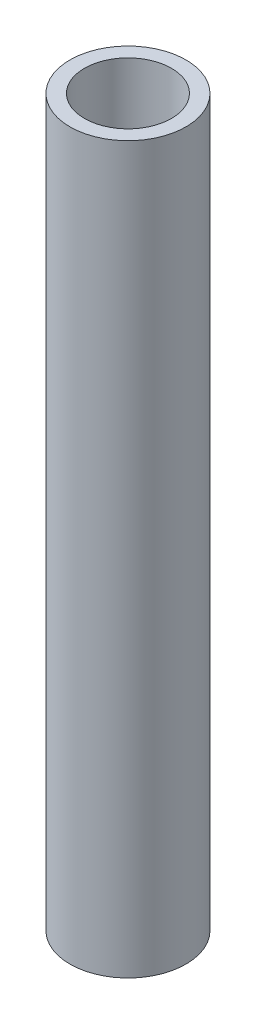
ISO-10303-21;
HEADER;
FILE_DESCRIPTION(('STEP AP214'),'2;1');
FILE_NAME('part.step','',(''),(''),'','','');
FILE_SCHEMA(('AUTOMOTIVE_DESIGN { 1 0 10303 214 1 1 1 1 }'));
ENDSEC;
DATA;
#1=APPLICATION_CONTEXT('core data for automotive mechanical design processes');
#2=APPLICATION_PROTOCOL_DEFINITION('international standard','automotive_design',2000,#1);
#3=PRODUCT_CONTEXT('',#1,'mechanical');
#4=PRODUCT('Part','Part','',(#3));
#5=PRODUCT_RELATED_PRODUCT_CATEGORY('part','',(#4));
#6=PRODUCT_DEFINITION_FORMATION('','',#4);
#7=PRODUCT_DEFINITION_CONTEXT('part definition',#1,'design');
#8=PRODUCT_DEFINITION('design','',#6,#7);
#9=PRODUCT_DEFINITION_SHAPE('','',#8);
#10=(LENGTH_UNIT() NAMED_UNIT(*) SI_UNIT(.MILLI.,.METRE.));
#11=(NAMED_UNIT(*) PLANE_ANGLE_UNIT() SI_UNIT($,.RADIAN.));
#12=(NAMED_UNIT(*) SI_UNIT($,.STERADIAN.) SOLID_ANGLE_UNIT());
#13=UNCERTAINTY_MEASURE_WITH_UNIT(LENGTH_MEASURE(1.E-05),#10,'distance_accuracy_value','');
#14=(GEOMETRIC_REPRESENTATION_CONTEXT(3) GLOBAL_UNCERTAINTY_ASSIGNED_CONTEXT((#13)) GLOBAL_UNIT_ASSIGNED_CONTEXT((#10,
#11,#12)) REPRESENTATION_CONTEXT('',''));
#15=CARTESIAN_POINT('',(0.,0.,0.));
#16=DIRECTION('',(0.,0.,1.));
#17=DIRECTION('',(1.,0.,0.));
#18=AXIS2_PLACEMENT_3D('',#15,#16,#17);
#19=CARTESIAN_POINT('',(0.,-41.,0.));
#20=DIRECTION('',(0.,1.,0.));
#21=DIRECTION('',(0.,0.,1.));
#22=AXIS2_PLACEMENT_3D('',#19,#20,#21);
#23=CYLINDRICAL_SURFACE('',#22,4.);
#24=CARTESIAN_POINT('',(0.,-41.,0.));
#25=DIRECTION('',(0.,1.,0.));
#26=DIRECTION('',(0.,0.,1.));
#27=AXIS2_PLACEMENT_3D('',#24,#25,#26);
#28=CIRCLE('',#27,4.);
#29=CARTESIAN_POINT('',(0.,-41.,4.));
#30=VERTEX_POINT('',#29);
#31=EDGE_CURVE('E10',#30,#30,#28,.T.);
#32=ORIENTED_EDGE('',*,*,#31,.T.);
#33=EDGE_LOOP('',(#32));
#34=FACE_BOUND('',#33,.T.);
#35=CARTESIAN_POINT('',(0.,9.,0.));
#36=DIRECTION('',(0.,1.,0.));
#37=DIRECTION('',(0.,0.,1.));
#38=AXIS2_PLACEMENT_3D('',#35,#36,#37);
#39=CIRCLE('',#38,4.);
#40=CARTESIAN_POINT('',(0.,9.,4.));
#41=VERTEX_POINT('',#40);
#42=EDGE_CURVE('E40',#41,#41,#39,.T.);
#43=ORIENTED_EDGE('',*,*,#42,.F.);
#44=EDGE_LOOP('',(#43));
#45=FACE_BOUND('',#44,.T.);
#46=ADVANCED_FACE('F30',(#34,#45),#23,.T.);
#47=CARTESIAN_POINT('',(0.,-41.,0.));
#48=DIRECTION('',(0.,1.,0.));
#49=DIRECTION('',(0.,0.,1.));
#50=AXIS2_PLACEMENT_3D('',#47,#48,#49);
#51=PLANE('',#50);
#52=CARTESIAN_POINT('',(0.,-41.,0.));
#53=DIRECTION('',(0.,1.,0.));
#54=DIRECTION('',(0.,0.,1.));
#55=AXIS2_PLACEMENT_3D('',#52,#53,#54);
#56=CIRCLE('',#55,3.);
#57=CARTESIAN_POINT('',(0.,-41.,3.));
#58=VERTEX_POINT('',#57);
#59=EDGE_CURVE('E36',#58,#58,#56,.T.);
#60=ORIENTED_EDGE('',*,*,#59,.T.);
#61=EDGE_LOOP('',(#60));
#62=FACE_BOUND('',#61,.T.);
#63=ORIENTED_EDGE('',*,*,#31,.F.);
#64=EDGE_LOOP('',(#63));
#65=FACE_BOUND('',#64,.T.);
#66=ADVANCED_FACE('F59',(#62,#65),#51,.F.);
#67=CARTESIAN_POINT('',(0.,-41.,0.));
#68=DIRECTION('',(0.,1.,0.));
#69=DIRECTION('',(0.,0.,1.));
#70=AXIS2_PLACEMENT_3D('',#67,#68,#69);
#71=CYLINDRICAL_SURFACE('',#70,3.);
#72=ORIENTED_EDGE('',*,*,#59,.F.);
#73=EDGE_LOOP('',(#72));
#74=FACE_BOUND('',#73,.T.);
#75=CARTESIAN_POINT('',(0.,9.,0.));
#76=DIRECTION('',(0.,1.,0.));
#77=DIRECTION('',(0.,0.,1.));
#78=AXIS2_PLACEMENT_3D('',#75,#76,#77);
#79=CIRCLE('',#78,3.);
#80=CARTESIAN_POINT('',(0.,9.,3.));
#81=VERTEX_POINT('',#80);
#82=EDGE_CURVE('E44',#81,#81,#79,.T.);
#83=ORIENTED_EDGE('',*,*,#82,.T.);
#84=EDGE_LOOP('',(#83));
#85=FACE_BOUND('',#84,.T.);
#86=ADVANCED_FACE('F50',(#74,#85),#71,.F.);
#87=CARTESIAN_POINT('',(0.,9.,0.));
#88=DIRECTION('',(0.,1.,0.));
#89=DIRECTION('',(0.,0.,1.));
#90=AXIS2_PLACEMENT_3D('',#87,#88,#89);
#91=PLANE('',#90);
#92=ORIENTED_EDGE('',*,*,#42,.T.);
#93=EDGE_LOOP('',(#92));
#94=FACE_BOUND('',#93,.T.);
#95=ORIENTED_EDGE('',*,*,#82,.F.);
#96=EDGE_LOOP('',(#95));
#97=FACE_BOUND('',#96,.T.);
#98=ADVANCED_FACE('F52',(#94,#97),#91,.T.);
#99=CLOSED_SHELL('',(#46,#66,#86,#98));
#100=MANIFOLD_SOLID_BREP('B2',#99);
#101=ADVANCED_BREP_SHAPE_REPRESENTATION('',(#18,#100),#14);
#102=SHAPE_DEFINITION_REPRESENTATION(#9,#101);
ENDSEC;
END-ISO-10303-21;
